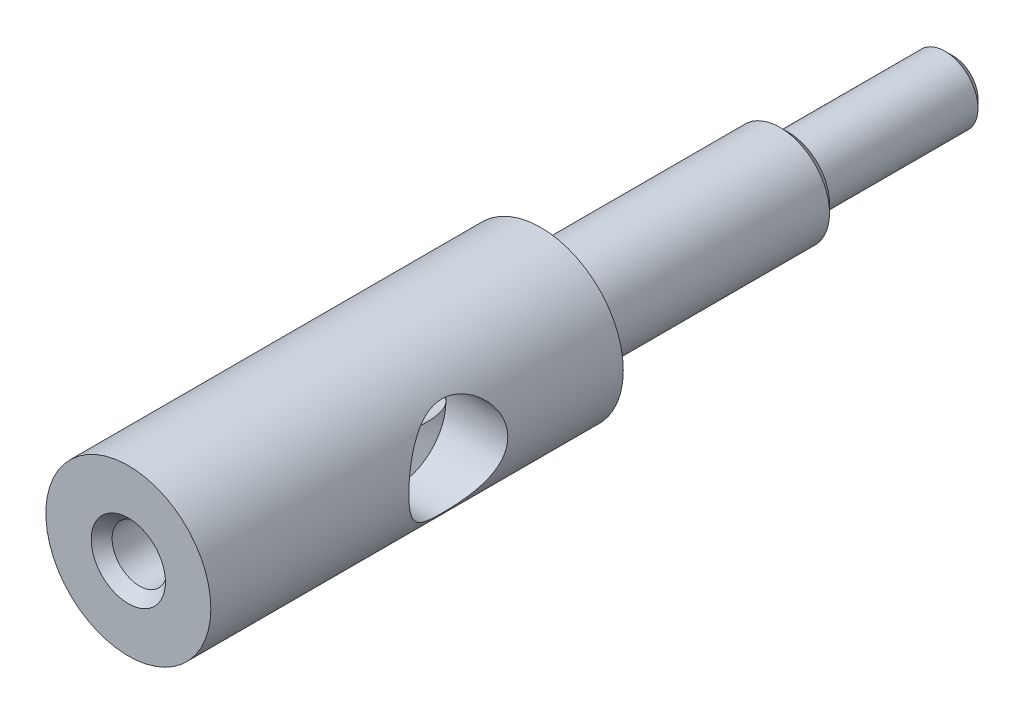
ISO-10303-21;
HEADER;
FILE_DESCRIPTION(('STEP AP214'),'2;1');
FILE_NAME('part.step','',(''),(''),'','','');
FILE_SCHEMA(('AUTOMOTIVE_DESIGN { 1 0 10303 214 1 1 1 1 }'));
ENDSEC;
DATA;
#1=APPLICATION_CONTEXT('core data for automotive mechanical design processes');
#2=APPLICATION_PROTOCOL_DEFINITION('international standard','automotive_design',2000,#1);
#3=PRODUCT_CONTEXT('',#1,'mechanical');
#4=PRODUCT('Part','Part','',(#3));
#5=PRODUCT_RELATED_PRODUCT_CATEGORY('part','',(#4));
#6=PRODUCT_DEFINITION_FORMATION('','',#4);
#7=PRODUCT_DEFINITION_CONTEXT('part definition',#1,'design');
#8=PRODUCT_DEFINITION('design','',#6,#7);
#9=PRODUCT_DEFINITION_SHAPE('','',#8);
#10=(LENGTH_UNIT() NAMED_UNIT(*) SI_UNIT(.MILLI.,.METRE.));
#11=(NAMED_UNIT(*) PLANE_ANGLE_UNIT() SI_UNIT($,.RADIAN.));
#12=(NAMED_UNIT(*) SI_UNIT($,.STERADIAN.) SOLID_ANGLE_UNIT());
#13=UNCERTAINTY_MEASURE_WITH_UNIT(LENGTH_MEASURE(1.E-05),#10,'distance_accuracy_value','');
#14=(GEOMETRIC_REPRESENTATION_CONTEXT(3) GLOBAL_UNCERTAINTY_ASSIGNED_CONTEXT((#13)) GLOBAL_UNIT_ASSIGNED_CONTEXT((#10,
#11,#12)) REPRESENTATION_CONTEXT('',''));
#15=CARTESIAN_POINT('',(0.,0.,0.));
#16=DIRECTION('',(0.,0.,1.));
#17=DIRECTION('',(1.,0.,0.));
#18=AXIS2_PLACEMENT_3D('',#15,#16,#17);
#19=CARTESIAN_POINT('',(0.,0.,-49.000000000035));
#20=DIRECTION('',(0.,0.,1.));
#21=DIRECTION('',(0.,-1.,0.));
#22=AXIS2_PLACEMENT_3D('',#19,#20,#21);
#23=CONICAL_SURFACE('',#22,3.99999999990541,0.785398163369027);
#24=CARTESIAN_POINT('',(0.,0.,-49.));
#25=DIRECTION('',(0.,0.,-1.));
#26=DIRECTION('',(-1.,0.,0.));
#27=AXIS2_PLACEMENT_3D('',#24,#25,#26);
#28=CIRCLE('',#27,4.);
#29=CARTESIAN_POINT('',(-4.,0.,-49.));
#30=VERTEX_POINT('',#29);
#31=EDGE_CURVE('E65',#30,#30,#28,.F.);
#32=ORIENTED_EDGE('',*,*,#31,.F.);
#33=EDGE_LOOP('',(#32));
#34=FACE_BOUND('',#33,.T.);
#35=CARTESIAN_POINT('',(0.,0.,-49.9999999999545));
#36=DIRECTION('',(0.,0.,1.));
#37=DIRECTION('',(0.,-1.,0.));
#38=AXIS2_PLACEMENT_3D('',#35,#36,#37);
#39=CIRCLE('',#38,3.00000000004275);
#40=CARTESIAN_POINT('',(0.,-3.00000000004275,-49.9999999999545));
#41=VERTEX_POINT('',#40);
#42=EDGE_CURVE('E19',#41,#41,#39,.T.);
#43=ORIENTED_EDGE('',*,*,#42,.T.);
#44=EDGE_LOOP('',(#43));
#45=FACE_BOUND('',#44,.T.);
#46=ADVANCED_FACE('F16',(#34,#45),#23,.T.);
#47=CARTESIAN_POINT('',(0.,0.,-30.));
#48=DIRECTION('',(0.,0.,-1.));
#49=DIRECTION('',(-1.,0.,0.));
#50=AXIS2_PLACEMENT_3D('',#47,#48,#49);
#51=CYLINDRICAL_SURFACE('',#50,4.);
#52=ORIENTED_EDGE('',*,*,#31,.T.);
#53=EDGE_LOOP('',(#52));
#54=FACE_BOUND('',#53,.T.);
#55=CARTESIAN_POINT('',(0.,0.,-30.));
#56=DIRECTION('',(0.,0.,-1.));
#57=DIRECTION('',(-1.,0.,0.));
#58=AXIS2_PLACEMENT_3D('',#55,#56,#57);
#59=CIRCLE('',#58,4.);
#60=CARTESIAN_POINT('',(-4.,0.,-30.));
#61=VERTEX_POINT('',#60);
#62=EDGE_CURVE('E54',#61,#61,#59,.T.);
#63=ORIENTED_EDGE('',*,*,#62,.T.);
#64=EDGE_LOOP('',(#63));
#65=FACE_BOUND('',#64,.T.);
#66=ADVANCED_FACE('F48',(#54,#65),#51,.T.);
#67=CARTESIAN_POINT('',(0.,0.,34.9999999999682));
#68=DIRECTION('',(0.,0.,1.));
#69=DIRECTION('',(1.,0.,0.));
#70=AXIS2_PLACEMENT_3D('',#67,#68,#69);
#71=CONICAL_SURFACE('',#70,3.3235000000218,1.02974425868355);
#72=CARTESIAN_POINT('',(0.,0.,33.0030397326482));
#73=VERTEX_POINT('',#72);
#74=VERTEX_LOOP('',#73);
#75=FACE_BOUND('',#74,.T.);
#76=CARTESIAN_POINT('',(0.,0.,35.));
#77=DIRECTION('',(0.,0.,1.));
#78=DIRECTION('',(1.,0.,0.));
#79=AXIS2_PLACEMENT_3D('',#76,#77,#78);
#80=CIRCLE('',#79,3.3235);
#81=CARTESIAN_POINT('',(3.3235,0.,35.));
#82=VERTEX_POINT('',#81);
#83=EDGE_CURVE('E52',#82,#82,#80,.T.);
#84=ORIENTED_EDGE('',*,*,#83,.T.);
#85=EDGE_LOOP('',(#84));
#86=FACE_BOUND('',#85,.T.);
#87=ADVANCED_FACE('F44',(#75,#86),#71,.F.);
#88=CARTESIAN_POINT('',(0.,0.,26.0000000000105));
#89=DIRECTION('',(0.,0.,-1.));
#90=DIRECTION('',(-1.,0.,0.));
#91=AXIS2_PLACEMENT_3D('',#88,#89,#90);
#92=CONICAL_SURFACE('',#91,2.49999999999773,1.0297442586719);
#93=CARTESIAN_POINT('',(0.,0.,27.5021515475942));
#94=VERTEX_POINT('',#93);
#95=VERTEX_LOOP('',#94);
#96=FACE_BOUND('',#95,.T.);
#97=CARTESIAN_POINT('',(0.,0.,26.));
#98=DIRECTION('',(0.,0.,-1.));
#99=DIRECTION('',(-1.,0.,0.));
#100=AXIS2_PLACEMENT_3D('',#97,#98,#99);
#101=CIRCLE('',#100,2.5);
#102=CARTESIAN_POINT('',(2.5,0.,25.9999999999689));
#103=VERTEX_POINT('',#102);
#104=EDGE_CURVE('E37',#103,#103,#101,.T.);
#105=ORIENTED_EDGE('',*,*,#104,.T.);
#106=EDGE_LOOP('',(#105));
#107=FACE_BOUND('',#106,.T.);
#108=ADVANCED_FACE('F47',(#96,#107),#92,.F.);
#109=CARTESIAN_POINT('',(0.,0.,-50.));
#110=DIRECTION('',(0.,0.,1.));
#111=DIRECTION('',(1.,0.,0.));
#112=AXIS2_PLACEMENT_3D('',#109,#110,#111);
#113=PLANE('',#112);
#114=CARTESIAN_POINT('',(0.,0.,-50.));
#115=DIRECTION('',(0.,0.,-1.));
#116=DIRECTION('',(-1.,0.,0.));
#117=AXIS2_PLACEMENT_3D('',#114,#115,#116);
#118=CIRCLE('',#117,2.5);
#119=CARTESIAN_POINT('',(-2.5,0.,-50.));
#120=VERTEX_POINT('',#119);
#121=EDGE_CURVE('E56',#120,#120,#118,.F.);
#122=ORIENTED_EDGE('',*,*,#121,.T.);
#123=EDGE_LOOP('',(#122));
#124=FACE_BOUND('',#123,.T.);
#125=ORIENTED_EDGE('',*,*,#42,.F.);
#126=EDGE_LOOP('',(#125));
#127=FACE_BOUND('',#126,.T.);
#128=ADVANCED_FACE('F165',(#124,#127),#113,.F.);
#129=CARTESIAN_POINT('',(0.,0.,-30.));
#130=DIRECTION('',(0.,0.,1.));
#131=DIRECTION('',(1.,0.,0.));
#132=AXIS2_PLACEMENT_3D('',#129,#130,#131);
#133=PLANE('',#132);
#134=ORIENTED_EDGE('',*,*,#62,.F.);
#135=EDGE_LOOP('',(#134));
#136=FACE_BOUND('',#135,.T.);
#137=CARTESIAN_POINT('',(0.,0.,-29.9999999999727));
#138=DIRECTION('',(0.,0.,1.));
#139=DIRECTION('',(1.,0.,0.));
#140=AXIS2_PLACEMENT_3D('',#137,#138,#139);
#141=CIRCLE('',#140,4.99999999999545);
#142=CARTESIAN_POINT('',(4.99999999999545,0.,-29.9999999999727));
#143=VERTEX_POINT('',#142);
#144=EDGE_CURVE('E156',#143,#143,#141,.T.);
#145=ORIENTED_EDGE('',*,*,#144,.F.);
#146=EDGE_LOOP('',(#145));
#147=FACE_BOUND('',#146,.T.);
#148=ADVANCED_FACE('F168',(#136,#147),#133,.F.);
#149=CARTESIAN_POINT('',(0.,0.,42.5));
#150=DIRECTION('',(0.,0.,1.));
#151=DIRECTION('',(1.,0.,0.));
#152=AXIS2_PLACEMENT_3D('',#149,#150,#151);
#153=CYLINDRICAL_SURFACE('',#152,3.3235);
#154=ORIENTED_EDGE('',*,*,#83,.F.);
#155=EDGE_LOOP('',(#154));
#156=FACE_BOUND('',#155,.T.);
#157=CARTESIAN_POINT('',(0.,0.,48.6465915689109));
#158=DIRECTION('',(0.,0.,1.));
#159=DIRECTION('',(1.,0.,0.));
#160=AXIS2_PLACEMENT_3D('',#157,#158,#159);
#161=CIRCLE('',#160,3.32349999996495);
#162=CARTESIAN_POINT('',(3.32349999996495,0.,48.6465915689109));
#163=VERTEX_POINT('',#162);
#164=EDGE_CURVE('E158',#163,#163,#161,.T.);
#165=ORIENTED_EDGE('',*,*,#164,.T.);
#166=EDGE_LOOP('',(#165));
#167=FACE_BOUND('',#166,.T.);
#168=ADVANCED_FACE('F149',(#156,#167),#153,.F.);
#169=CARTESIAN_POINT('',(0.,0.,-12.));
#170=DIRECTION('',(0.,0.,-1.));
#171=DIRECTION('',(-1.,0.,0.));
#172=AXIS2_PLACEMENT_3D('',#169,#170,#171);
#173=CYLINDRICAL_SURFACE('',#172,2.5);
#174=ORIENTED_EDGE('',*,*,#121,.F.);
#175=EDGE_LOOP('',(#174));
#176=FACE_BOUND('',#175,.T.);
#177=CARTESIAN_POINT('',(2.49999999999481,0.,25.9999999999393));
#178=CARTESIAN_POINT('',(2.50000440681245,-0.0333647014409051,26.0000089604118));
#179=CARTESIAN_POINT('',(2.4993315897283,-0.0667108367074443,25.9986090904969));
#180=CARTESIAN_POINT('',(2.49667492201596,-0.133086425235274,25.9930803026044));
#181=CARTESIAN_POINT('',(2.49469255918183,-0.166116194772112,25.9889544816189));
#182=CARTESIAN_POINT('',(2.48690691588729,-0.263635379538542,25.9727472607381));
#183=CARTESIAN_POINT('',(2.47926276449362,-0.327370538569715,25.9568313606055));
#184=CARTESIAN_POINT('',(2.45740871646023,-0.466044168339284,25.911290808346));
#185=CARTESIAN_POINT('',(2.44206388668205,-0.540003916873495,25.8792939484901));
#186=CARTESIAN_POINT('',(2.40644179879068,-0.681467688186399,25.8049040663342));
#187=CARTESIAN_POINT('',(2.3861407929946,-0.748938381385714,25.7624609823794));
#188=CARTESIAN_POINT('',(2.32894881253672,-0.915266237996505,25.6426658142801));
#189=CARTESIAN_POINT('',(2.28936252993992,-1.00898545918877,25.5595454171396));
#190=CARTESIAN_POINT('',(2.20507738301818,-1.18190703195328,25.3818664703816));
#191=CARTESIAN_POINT('',(2.16036886281796,-1.26108120868553,25.2872862980932));
#192=CARTESIAN_POINT('',(2.06894794646331,-1.40591783384679,25.0929397810345));
#193=CARTESIAN_POINT('',(2.02230036144602,-1.47183690405202,24.9933311589933));
#194=CARTESIAN_POINT('',(1.92726492600323,-1.59425736037914,24.789210529138));
#195=CARTESIAN_POINT('',(1.87887542404483,-1.65074950669691,24.6846938377302));
#196=CARTESIAN_POINT('',(1.78101652617295,-1.75588973577199,24.4718102542157));
#197=CARTESIAN_POINT('',(1.73154407094235,-1.80451107291804,24.363431700513));
#198=CARTESIAN_POINT('',(1.63224068545022,-1.89480671777135,24.1439510032605));
#199=CARTESIAN_POINT('',(1.58240963155579,-1.93647849675054,24.0328478851205));
#200=CARTESIAN_POINT('',(1.48194952665245,-2.01443333240198,23.8063666898566));
#201=CARTESIAN_POINT('',(1.43132319836142,-2.05059962642193,23.6909475028284));
#202=CARTESIAN_POINT('',(1.33068982511614,-2.11728761521465,23.4582040881588));
#203=CARTESIAN_POINT('',(1.28068291247457,-2.14780812275678,23.3408794654604));
#204=CARTESIAN_POINT('',(1.18173949733217,-2.20379800338344,23.1043937169465));
#205=CARTESIAN_POINT('',(1.13280455199716,-2.22926041254413,22.985230299287));
#206=CARTESIAN_POINT('',(1.03667418576344,-2.27555501209775,22.7453358707929));
#207=CARTESIAN_POINT('',(0.989478522006144,-2.29638785098382,22.6246050820207));
#208=CARTESIAN_POINT('',(0.897798370061056,-2.33375102581922,22.3822099147138));
#209=CARTESIAN_POINT('',(0.853300765528386,-2.35030371438694,22.2605539486361));
#210=CARTESIAN_POINT('',(0.767672599828388,-2.37964822557671,22.0155963734945));
#211=CARTESIAN_POINT('',(0.726542354624152,-2.39243969557057,21.8922946112633));
#212=CARTESIAN_POINT('',(0.64891861154054,-2.41464956223955,21.6440850815759));
#213=CARTESIAN_POINT('',(0.612419648701658,-2.42407195878979,21.5191794021648));
#214=CARTESIAN_POINT('',(0.545563242301532,-2.43998762457775,21.2675798928309));
#215=CARTESIAN_POINT('',(0.515204029970234,-2.44648173807472,21.1408865891794));
#216=CARTESIAN_POINT('',(0.456524071725755,-2.45818827647866,20.8567938630557));
#217=CARTESIAN_POINT('',(0.430216815922438,-2.46277876595564,20.6989295023741));
#218=CARTESIAN_POINT('',(0.402323931497229,-2.46743168729128,20.4608108933444));
#219=CARTESIAN_POINT('',(0.394954682091408,-2.4686105104716,20.3812367877592));
#220=CARTESIAN_POINT('',(0.384345653303792,-2.47028521539029,20.2218113070941));
#221=CARTESIAN_POINT('',(0.381105228363137,-2.47078120389367,20.1419599773175));
#222=CARTESIAN_POINT('',(0.378899386542305,-2.47112055428709,19.9822585346068));
#223=CARTESIAN_POINT('',(0.37993061867878,-2.47096442774049,19.9024084698396));
#224=CARTESIAN_POINT('',(0.386207329038559,-2.46999020145378,19.7428855276762));
#225=CARTESIAN_POINT('',(0.391452818180722,-2.46917209999854,19.6632126507396));
#226=CARTESIAN_POINT('',(0.413224618459184,-2.46565961111647,19.4246610652575));
#227=CARTESIAN_POINT('',(0.435786978174012,-2.46190682097384,19.2663225303981));
#228=CARTESIAN_POINT('',(0.485858605160425,-2.45242405258385,18.9955977598412));
#229=CARTESIAN_POINT('',(0.510290324013049,-2.44752413629555,18.8825747972644));
#230=CARTESIAN_POINT('',(0.564592096191312,-2.43557199073528,18.6579519278107));
#231=CARTESIAN_POINT('',(0.594462558550212,-2.42851959955448,18.5463521286422));
#232=CARTESIAN_POINT('',(0.658477271102162,-2.41194957007288,18.3244685431261));
#233=CARTESIAN_POINT('',(0.692625639580007,-2.40242954664362,18.2141861386118));
#234=CARTESIAN_POINT('',(0.764177622305014,-2.38063686095771,17.994972791996));
#235=CARTESIAN_POINT('',(0.801580996506212,-2.36836440157906,17.8860417509117));
#236=CARTESIAN_POINT('',(0.878981755213392,-2.34074473510835,17.6691001959068));
#237=CARTESIAN_POINT('',(0.918987072526821,-2.32538779542411,17.5610937534275));
#238=CARTESIAN_POINT('',(1.00085986189637,-2.29134132270932,17.346318499192));
#239=CARTESIAN_POINT('',(1.04272748523265,-2.27265151856874,17.2395497888716));
#240=CARTESIAN_POINT('',(1.17026524329169,-2.21119649052992,16.9213029638315));
#241=CARTESIAN_POINT('',(1.25796395576036,-2.16301446311637,16.7116287835089));
#242=CARTESIAN_POINT('',(1.41632267974261,-2.06175898025363,16.342938931294));
#243=CARTESIAN_POINT('',(1.48654482417255,-2.01202270239156,16.1828144986984));
#244=CARTESIAN_POINT('',(1.62735887646,-1.89995939641595,15.866470420907));
#245=CARTESIAN_POINT('',(1.69795126571689,-1.83759616177024,15.7102634901181));
#246=CARTESIAN_POINT('',(1.81564288236882,-1.7198817749987,15.4526303041616));
#247=CARTESIAN_POINT('',(1.86309996623077,-1.66856805838708,15.349526739544));
#248=CARTESIAN_POINT('',(1.95682751440309,-1.55759902881056,15.1471194073623));
#249=CARTESIAN_POINT('',(2.00309672869214,-1.49793532310982,15.0478195925341));
#250=CARTESIAN_POINT('',(2.09317396674211,-1.36921772291159,14.8554369092552));
#251=CARTESIAN_POINT('',(2.13699738805614,-1.30023496287849,14.7623142248855));
#252=CARTESIAN_POINT('',(2.22110338700733,-1.1506745879609,14.5842772299084));
#253=CARTESIAN_POINT('',(2.26139504554374,-1.07012820344345,14.4993418084415));
#254=CARTESIAN_POINT('',(2.32334102582648,-0.925186912321404,14.369136064445));
#255=CARTESIAN_POINT('',(2.34664077121755,-0.864758206656846,14.3202674571952));
#256=CARTESIAN_POINT('',(2.38976686599506,-0.737253870397121,14.2299546082895));
#257=CARTESIAN_POINT('',(2.40959081575257,-0.670173697373946,14.1885154953859));
#258=CARTESIAN_POINT('',(2.44463955141455,-0.528345642952532,14.1153323964892));
#259=CARTESIAN_POINT('',(2.45979229301216,-0.453499373684774,14.0837402053272));
#260=CARTESIAN_POINT('',(2.48334956968723,-0.298397672861388,14.034654771837));
#261=CARTESIAN_POINT('',(2.49178337756962,-0.218167375144953,14.0171003689086));
#262=CARTESIAN_POINT('',(2.49749499830045,-0.114221666657666,14.0052130518354));
#263=CARTESIAN_POINT('',(2.49843254982911,-0.0914361726176279,14.0032618912506));
#264=CARTESIAN_POINT('',(2.49968450884905,-0.0457712137515304,14.0006564911939));
#265=CARTESIAN_POINT('',(2.49999883704919,-0.0228917373393486,14.000002416747));
#266=CARTESIAN_POINT('',(2.5,0.,14.0000000000622));
#267=B_SPLINE_CURVE_WITH_KNOTS('',3,(#177,#178,#179,#180,#181,#182,#183,#184,#185,#186,#187,
#188,#189,#190,#191,#192,#193,#194,#195,#196,#197,#198,#199,#200,#201,#202,#203,#204,#205,#206,
#207,#208,#209,#210,#211,#212,#213,#214,#215,#216,#217,#218,#219,#220,#221,#222,#223,#224,#225,
#226,#227,#228,#229,#230,#231,#232,#233,#234,#235,#236,#237,#238,#239,#240,#241,#242,#243,#244,
#245,#246,#247,#248,#249,#250,#251,#252,#253,#254,#255,#256,#257,#258,#259,#260,#261,#262,#263,
#264,#265,#266),.UNSPECIFIED.,.F.,.F.,(4,2,2,2,2,2,2,2,2,2,2,2,2,2,2,2,2,2,2,2,2,2,2,2,2,2,2,2,
2,2,2,2,2,2,2,2,2,2,2,2,2,2,2,2,4),(0.,0.100023840999682,0.199934238441364,0.39734357782308,
0.642094196968456,0.888041392566701,1.27995715543761,1.67262426279943,2.05674321408231,
2.44123647604187,2.8270100277764,3.21292364567541,3.60613270583752,3.99942435864968,
4.39325379355398,4.78702802746034,5.1787022754696,5.57041323269155,5.96165758139093,
6.35278905739761,6.83237007424446,7.07204644652874,7.31168533981601,7.55113627939188,
7.7905878393711,8.26970926304435,8.61677245997098,8.96386176937596,9.31128782256876,
9.65868827591028,10.0072026218071,10.3557453303551,11.0520109792988,11.5970010382104,
12.1435765140528,12.5169977312065,12.890797013503,13.2618891845024,13.6319973540561,
13.8748753351452,14.1179203403268,14.3645452748032,14.6100897550906,14.6787205983664,
14.7473601728117),.UNSPECIFIED.);
#268=CARTESIAN_POINT('',(2.5,0.,14.0000000000311));
#269=VERTEX_POINT('',#268);
#270=EDGE_CURVE('E32',#103,#269,#267,.T.);
#271=ORIENTED_EDGE('',*,*,#270,.T.);
#272=CARTESIAN_POINT('',(2.49999999999842,0.,14.0000000000617));
#273=CARTESIAN_POINT('',(2.50000440681378,0.0333647014405211,13.9999910395885));
#274=CARTESIAN_POINT('',(2.49933158972868,0.0667108367066879,14.0013909095032));
#275=CARTESIAN_POINT('',(2.49667492201567,0.133086425233795,14.0069196973954));
#276=CARTESIAN_POINT('',(2.49469255918182,0.166116194770283,14.011045518381));
#277=CARTESIAN_POINT('',(2.48690691588783,0.263635379535687,14.0272527392618));
#278=CARTESIAN_POINT('',(2.47926276449415,0.327370538566187,14.0431686393943));
#279=CARTESIAN_POINT('',(2.45740871646105,0.466044168334317,14.0887091916534));
#280=CARTESIAN_POINT('',(2.44206388668327,0.540003916867769,14.1207060515091));
#281=CARTESIAN_POINT('',(2.40644179879272,0.681467688179206,14.1950959336646));
#282=CARTESIAN_POINT('',(2.38614079299706,0.748938381377815,14.2375390176191));
#283=CARTESIAN_POINT('',(2.32894881254032,0.915266237987211,14.3573341857178));
#284=CARTESIAN_POINT('',(2.28936252994428,1.00898545917879,14.440454582858));
#285=CARTESIAN_POINT('',(2.20507738302415,1.18190703194207,14.6181335296153));
#286=CARTESIAN_POINT('',(2.16036886282479,1.26108120867376,14.7127137019034));
#287=CARTESIAN_POINT('',(2.06894794647165,1.40591783383448,14.9070602189618));
#288=CARTESIAN_POINT('',(2.022300361455,1.47183690403965,15.0066688410032));
#289=CARTESIAN_POINT('',(1.92726492601351,1.59425736036668,15.2107894708589));
#290=CARTESIAN_POINT('',(1.87887542405579,1.65074950668442,15.3153061622669));
#291=CARTESIAN_POINT('',(1.78101652618527,1.75588973575947,15.5281897457817));
#292=CARTESIAN_POINT('',(1.73154407095537,1.80451107290553,15.6365682994847));
#293=CARTESIAN_POINT('',(1.63224068546465,1.8948067177589,15.8560489967375));
#294=CARTESIAN_POINT('',(1.58240963157094,1.93647849673814,15.9671521148777));
#295=CARTESIAN_POINT('',(1.48194952666871,2.01443333239002,16.1936333101428));
#296=CARTESIAN_POINT('',(1.43132319837806,2.05059962641031,16.3090524971721));
#297=CARTESIAN_POINT('',(1.33068982513359,2.11728761520368,16.5417959118438));
#298=CARTESIAN_POINT('',(1.28068291249242,2.14780812274613,16.6591205345432));
#299=CARTESIAN_POINT('',(1.18173949735089,2.20379800337339,16.8956062830593));
#300=CARTESIAN_POINT('',(1.13280455201632,2.22926041253438,17.0147697007198));
#301=CARTESIAN_POINT('',(1.03667418578355,2.27555501208858,17.254664129216));
#302=CARTESIAN_POINT('',(0.989478522026754,2.29638785097493,17.3753949179893));
#303=CARTESIAN_POINT('',(0.89779837008274,2.33375102581087,17.6177900852983));
#304=CARTESIAN_POINT('',(0.853300765550645,2.35030371437885,17.739446051377));
#305=CARTESIAN_POINT('',(0.767672599851869,2.37964822556913,17.9844036265207));
#306=CARTESIAN_POINT('',(0.726542354648281,2.39243969556323,18.1077053887529));
#307=CARTESIAN_POINT('',(0.648918611566054,2.41464956223268,18.3559149184424));
#308=CARTESIAN_POINT('',(0.61241964872791,2.42407195878315,18.4808205978545));
#309=CARTESIAN_POINT('',(0.545563242329362,2.43998762457152,18.7324201071904));
#310=CARTESIAN_POINT('',(0.515204029998904,2.44648173806868,18.8591134108429));
#311=CARTESIAN_POINT('',(0.456524071755983,2.45818827647303,19.1432061369708));
#312=CARTESIAN_POINT('',(0.430216815953563,2.4627787659502,19.3010704976556));
#313=CARTESIAN_POINT('',(0.402323931530046,2.46743168728593,19.53918910669));
#314=CARTESIAN_POINT('',(0.394954682124847,2.46861051046625,19.6187632122768));
#315=CARTESIAN_POINT('',(0.384345653338572,2.47028521538488,19.7781886929451));
#316=CARTESIAN_POINT('',(0.381105228398636,2.4707812038882,19.8580400227232));
#317=CARTESIAN_POINT('',(0.37889938657931,2.47112055428142,20.017741465437));
#318=CARTESIAN_POINT('',(0.379930618716576,2.47096442773468,20.0975915302057));
#319=CARTESIAN_POINT('',(0.386207329077979,2.46999020144762,20.2571144723722));
#320=CARTESIAN_POINT('',(0.391452818220973,2.46917209999216,20.3367873493103));
#321=CARTESIAN_POINT('',(0.413224618501941,2.46565961110932,20.5753389347969));
#322=CARTESIAN_POINT('',(0.43578697821845,2.46190682096599,20.7336774696592));
#323=CARTESIAN_POINT('',(0.4858586052079,2.45242405257446,21.0044022402226));
#324=CARTESIAN_POINT('',(0.510290324062013,2.44752413628536,21.117425202803));
#325=CARTESIAN_POINT('',(0.564592096243277,2.43557199072325,21.3420480722638));
#326=CARTESIAN_POINT('',(0.594462558603688,2.42851959954141,21.4536478714358));
#327=CARTESIAN_POINT('',(0.658477271158635,2.41194957005749,21.6755314569589));
#328=CARTESIAN_POINT('',(0.692625639637965,2.40242954662694,21.7858138614767));
#329=CARTESIAN_POINT('',(0.764177622365896,2.38063686093819,22.0050272080994));
#330=CARTESIAN_POINT('',(0.801580996568533,2.368364401558,22.1139582491871));
#331=CARTESIAN_POINT('',(0.878981755278501,2.34074473508393,22.3308998041988));
#332=CARTESIAN_POINT('',(0.918987072593278,2.32538779539788,22.4389062466814));
#333=CARTESIAN_POINT('',(1.00085986196545,2.29134132267918,22.6536815009234));
#334=CARTESIAN_POINT('',(1.04272748530301,2.2726515185365,22.760450211247));
#335=CARTESIAN_POINT('',(1.17026524336576,2.2111964904909,23.0786970362967));
#336=CARTESIAN_POINT('',(1.25796395583675,2.16301446307219,23.2883712166255));
#337=CARTESIAN_POINT('',(1.41632267981775,2.06175898020193,23.6570610688392));
#338=CARTESIAN_POINT('',(1.48654482424412,2.01202270233858,23.8171855014278));
#339=CARTESIAN_POINT('',(1.62735887652412,1.89995939636092,24.1335295792052));
#340=CARTESIAN_POINT('',(1.69795126577714,1.83759616171444,24.2897365099871));
#341=CARTESIAN_POINT('',(1.81564288242167,1.71988177494279,24.5473696959304));
#342=CARTESIAN_POINT('',(1.86309996628017,1.6685680583318,24.6504732605418));
#343=CARTESIAN_POINT('',(1.95682751444555,1.55759902875709,24.852880592711));
#344=CARTESIAN_POINT('',(2.00309672873111,1.49793532305754,24.952180407533));
#345=CARTESIAN_POINT('',(2.09317396677419,1.36921772286236,25.1445630907997));
#346=CARTESIAN_POINT('',(2.13699738808481,1.30023496283113,25.2376857751635));
#347=CARTESIAN_POINT('',(2.22110338702934,1.15067458791814,25.4157227701291));
#348=CARTESIAN_POINT('',(2.2613950455625,1.07012820340343,25.5006581915903));
#349=CARTESIAN_POINT('',(2.32334102584088,0.925186912285178,25.6308639355796));
#350=CARTESIAN_POINT('',(2.34664077123067,0.864758206621158,25.6797325428274));
#351=CARTESIAN_POINT('',(2.38976686600565,0.737253870362725,25.7700453917291));
#352=CARTESIAN_POINT('',(2.40959081576189,0.670173697340305,25.8114845046307));
#353=CARTESIAN_POINT('',(2.44463955142139,0.528345642920717,25.8846676035234));
#354=CARTESIAN_POINT('',(2.45979229301778,0.453499373654034,25.9162597946832));
#355=CARTESIAN_POINT('',(2.48334956969057,0.298397672833234,25.9653452281695));
#356=CARTESIAN_POINT('',(2.4917833775719,0.218167375118305,25.9828996310959));
#357=CARTESIAN_POINT('',(2.49749499830137,0.114221666636863,25.9947869481664));
#358=CARTESIAN_POINT('',(2.49843254982968,0.0914361726009671,25.9967381087505));
#359=CARTESIAN_POINT('',(2.49968450884916,0.045771213743211,25.9993435088063));
#360=CARTESIAN_POINT('',(2.49999883704919,0.0228917373352288,25.999997583253));
#361=CARTESIAN_POINT('',(2.5,1.21083793963502E-13,25.9999999999378));
#362=B_SPLINE_CURVE_WITH_KNOTS('',3,(#272,#273,#274,#275,#276,#277,#278,#279,#280,#281,#282,
#283,#284,#285,#286,#287,#288,#289,#290,#291,#292,#293,#294,#295,#296,#297,#298,#299,#300,#301,
#302,#303,#304,#305,#306,#307,#308,#309,#310,#311,#312,#313,#314,#315,#316,#317,#318,#319,#320,
#321,#322,#323,#324,#325,#326,#327,#328,#329,#330,#331,#332,#333,#334,#335,#336,#337,#338,#339,
#340,#341,#342,#343,#344,#345,#346,#347,#348,#349,#350,#351,#352,#353,#354,#355,#356,#357,#358,
#359,#360,#361),.UNSPECIFIED.,.F.,.F.,(4,2,2,2,2,2,2,2,2,2,2,2,2,2,2,2,2,2,2,2,2,2,2,2,2,2,2,2,
2,2,2,2,2,2,2,2,2,2,2,2,2,2,2,2,4),(0.,0.100023840998589,0.199934238439208,0.397343577818865,
0.642094196961783,0.888041392557537,1.27995715542575,1.67262426278488,2.05674321406743,
2.44123647602666,2.82701002776088,3.21292364565959,3.60613270582425,3.99942435863898,
4.39325379354586,4.78702802745479,5.17870227546643,5.57041323269075,5.96165758139249,
6.35278905740153,6.8323700742574,7.0720464465462,7.31168533983799,7.55113627941856,
7.79058783940248,8.26970926308516,8.61677246002335,8.96386176943987,9.31128782264423,
9.6586882759973,10.0072026219054,10.3557453304647,11.0520109794309,11.597001038321,
12.1435765141418,12.5169977312752,12.8907970135514,13.2618891845307,13.6319973540644,
13.8748753351476,14.1179203403234,14.3645452747938,14.6100897550753,14.6787205983385,
14.7473601727712),.UNSPECIFIED.);
#363=EDGE_CURVE('E113',#269,#103,#362,.T.);
#364=ORIENTED_EDGE('',*,*,#363,.T.);
#365=ORIENTED_EDGE('',*,*,#104,.F.);
#366=EDGE_LOOP('',(#271,#364,#365));
#367=FACE_BOUND('',#366,.T.);
#368=ADVANCED_FACE('F125',(#176,#367),#173,.F.);
#369=CARTESIAN_POINT('',(0.,0.,-29.0000000000532));
#370=DIRECTION('',(0.,0.,1.));
#371=DIRECTION('',(1.,0.,0.));
#372=AXIS2_PLACEMENT_3D('',#369,#370,#371);
#373=CONICAL_SURFACE('',#372,5.99999999991496,0.785398163397448);
#374=CARTESIAN_POINT('',(0.,0.,-29.));
#375=DIRECTION('',(0.,0.,-1.));
#376=DIRECTION('',(-1.,0.,0.));
#377=AXIS2_PLACEMENT_3D('',#374,#375,#376);
#378=CIRCLE('',#377,6.);
#379=CARTESIAN_POINT('',(-6.,0.,-29.));
#380=VERTEX_POINT('',#379);
#381=EDGE_CURVE('E112',#380,#380,#378,.F.);
#382=ORIENTED_EDGE('',*,*,#381,.F.);
#383=EDGE_LOOP('',(#382));
#384=FACE_BOUND('',#383,.T.);
#385=ORIENTED_EDGE('',*,*,#144,.T.);
#386=EDGE_LOOP('',(#385));
#387=FACE_BOUND('',#386,.T.);
#388=ADVANCED_FACE('F142',(#384,#387),#373,.T.);
#389=CARTESIAN_POINT('',(0.,0.,50.0000000000114));
#390=DIRECTION('',(0.,0.,1.));
#391=DIRECTION('',(1.,0.,0.));
#392=AXIS2_PLACEMENT_3D('',#389,#390,#391);
#393=CONICAL_SURFACE('',#392,4.50000000000728,0.715584993333689);
#394=ORIENTED_EDGE('',*,*,#164,.F.);
#395=EDGE_LOOP('',(#394));
#396=FACE_BOUND('',#395,.T.);
#397=CARTESIAN_POINT('',(0.,0.,50.0000000000114));
#398=DIRECTION('',(0.,0.,1.));
#399=DIRECTION('',(1.,0.,0.));
#400=AXIS2_PLACEMENT_3D('',#397,#398,#399);
#401=CIRCLE('',#400,4.50000000000728);
#402=CARTESIAN_POINT('',(4.50000000000728,0.,50.0000000000114));
#403=VERTEX_POINT('',#402);
#404=EDGE_CURVE('E109',#403,#403,#401,.T.);
#405=ORIENTED_EDGE('',*,*,#404,.T.);
#406=EDGE_LOOP('',(#405));
#407=FACE_BOUND('',#406,.T.);
#408=ADVANCED_FACE('F139',(#396,#407),#393,.F.);
#409=CARTESIAN_POINT('',(2.50000000005457,0.,20.));
#410=DIRECTION('',(1.,0.,0.));
#411=DIRECTION('',(0.,0.,-1.));
#412=AXIS2_PLACEMENT_3D('',#409,#410,#411);
#413=CONICAL_SURFACE('',#412,6.00000000002865,1.02974425868274);
#414=CARTESIAN_POINT('',(2.5,0.,20.));
#415=DIRECTION('',(1.,0.,0.));
#416=DIRECTION('',(0.,0.,-1.));
#417=AXIS2_PLACEMENT_3D('',#414,#415,#416);
#418=CIRCLE('',#417,6.);
#419=EDGE_CURVE('E107',#103,#269,#418,.T.);
#420=ORIENTED_EDGE('',*,*,#419,.T.);
#421=ORIENTED_EDGE('',*,*,#270,.F.);
#422=EDGE_LOOP('',(#420,#421));
#423=FACE_BOUND('',#422,.T.);
#424=ADVANCED_FACE('F134',(#423),#413,.F.);
#425=CARTESIAN_POINT('',(2.50000000005457,0.,20.));
#426=DIRECTION('',(1.,0.,0.));
#427=DIRECTION('',(0.,0.,-1.));
#428=AXIS2_PLACEMENT_3D('',#425,#426,#427);
#429=CONICAL_SURFACE('',#428,6.00000000002865,1.02974425869112);
#430=CARTESIAN_POINT('',(2.5,0.,20.));
#431=DIRECTION('',(1.,0.,0.));
#432=DIRECTION('',(0.,0.,-1.));
#433=AXIS2_PLACEMENT_3D('',#430,#431,#432);
#434=CIRCLE('',#433,6.);
#435=EDGE_CURVE('E61',#269,#103,#434,.T.);
#436=ORIENTED_EDGE('',*,*,#435,.T.);
#437=ORIENTED_EDGE('',*,*,#363,.F.);
#438=EDGE_LOOP('',(#436,#437));
#439=FACE_BOUND('',#438,.T.);
#440=ADVANCED_FACE('F129',(#439),#429,.F.);
#441=CARTESIAN_POINT('',(0.,0.,0.));
#442=DIRECTION('',(0.,0.,-1.));
#443=DIRECTION('',(-1.,0.,0.));
#444=AXIS2_PLACEMENT_3D('',#441,#442,#443);
#445=CYLINDRICAL_SURFACE('',#444,6.);
#446=ORIENTED_EDGE('',*,*,#381,.T.);
#447=EDGE_LOOP('',(#446));
#448=FACE_BOUND('',#447,.T.);
#449=CARTESIAN_POINT('',(0.,0.,0.));
#450=DIRECTION('',(0.,0.,-1.));
#451=DIRECTION('',(-1.,0.,0.));
#452=AXIS2_PLACEMENT_3D('',#449,#450,#451);
#453=CIRCLE('',#452,6.);
#454=CARTESIAN_POINT('',(-6.,0.,0.));
#455=VERTEX_POINT('',#454);
#456=EDGE_CURVE('E98',#455,#455,#453,.F.);
#457=ORIENTED_EDGE('',*,*,#456,.F.);
#458=EDGE_LOOP('',(#457));
#459=FACE_BOUND('',#458,.T.);
#460=ADVANCED_FACE('F133',(#448,#459),#445,.T.);
#461=CARTESIAN_POINT('',(0.,0.,50.));
#462=DIRECTION('',(0.,0.,-1.));
#463=DIRECTION('',(-1.,0.,0.));
#464=AXIS2_PLACEMENT_3D('',#461,#462,#463);
#465=PLANE('',#464);
#466=ORIENTED_EDGE('',*,*,#404,.F.);
#467=EDGE_LOOP('',(#466));
#468=FACE_BOUND('',#467,.T.);
#469=CARTESIAN_POINT('',(0.,0.,50.));
#470=DIRECTION('',(0.,0.,1.));
#471=DIRECTION('',(1.,0.,0.));
#472=AXIS2_PLACEMENT_3D('',#469,#470,#471);
#473=CIRCLE('',#472,10.);
#474=CARTESIAN_POINT('',(10.,0.,50.));
#475=VERTEX_POINT('',#474);
#476=EDGE_CURVE('E76',#475,#475,#473,.F.);
#477=ORIENTED_EDGE('',*,*,#476,.F.);
#478=EDGE_LOOP('',(#477));
#479=FACE_BOUND('',#478,.T.);
#480=ADVANCED_FACE('F93',(#468,#479),#465,.F.);
#481=CARTESIAN_POINT('',(6.25,0.,20.));
#482=DIRECTION('',(1.,0.,0.));
#483=DIRECTION('',(0.,0.,-1.));
#484=AXIS2_PLACEMENT_3D('',#481,#482,#483);
#485=CYLINDRICAL_SURFACE('',#484,6.);
#486=ORIENTED_EDGE('',*,*,#419,.F.);
#487=ORIENTED_EDGE('',*,*,#435,.F.);
#488=EDGE_LOOP('',(#486,#487));
#489=FACE_BOUND('',#488,.T.);
#490=CARTESIAN_POINT('',(10.,0.,14.));
#491=CARTESIAN_POINT('',(9.99999872825889,-0.153531686138264,14.0000013816903));
#492=CARTESIAN_POINT('',(9.99645510789288,-0.307105648462346,14.0059023860349));
#493=CARTESIAN_POINT('',(9.98236442021754,-0.61309557357246,14.0294317292242));
#494=CARTESIAN_POINT('',(9.9718131394423,-0.765510783841153,14.0470671235673));
#495=CARTESIAN_POINT('',(9.94394385208164,-1.06823499581478,14.0938698229989));
#496=CARTESIAN_POINT('',(9.92661287415165,-1.21853938448112,14.1230592352411));
#497=CARTESIAN_POINT('',(9.88560184438918,-1.51571516795823,14.192598590197));
#498=CARTESIAN_POINT('',(9.86191907649991,-1.66258506488647,14.232953307484));
#499=CARTESIAN_POINT('',(9.80890458439574,-1.95109688278542,14.3240880051035));
#500=CARTESIAN_POINT('',(9.77960431118666,-2.09276290971841,14.3748100412986));
#501=CARTESIAN_POINT('',(9.71591810779116,-2.37093574059979,14.4862764398217));
#502=CARTESIAN_POINT('',(9.68153021299886,-2.50744052583243,14.5470246748593));
#503=CARTESIAN_POINT('',(9.57184016398378,-2.90796746903218,14.7433867492464));
#504=CARTESIAN_POINT('',(9.48994089898179,-3.16337192847723,14.8932363424785));
#505=CARTESIAN_POINT('',(9.308211017848,-3.66523682496777,15.2391075398413));
#506=CARTESIAN_POINT('',(9.20748807553353,-3.90951948405156,15.437783798142));
#507=CARTESIAN_POINT('',(9.00120254438304,-4.36354438536642,15.8698969375821));
#508=CARTESIAN_POINT('',(8.89563384383488,-4.57324138603012,16.1033785999088));
#509=CARTESIAN_POINT('',(8.73441160726738,-4.87082590292458,16.4919991480812));
#510=CARTESIAN_POINT('',(8.67715712187566,-4.9718235251733,16.6366329285826));
#511=CARTESIAN_POINT('',(8.56585294266988,-5.1612216197681,16.9351950073579));
#512=CARTESIAN_POINT('',(8.51180377901337,-5.24962001158628,17.0891248347396));
#513=CARTESIAN_POINT('',(8.40890817248991,-5.41290816146996,17.4053785486951));
#514=CARTESIAN_POINT('',(8.36005495955987,-5.48781558810969,17.5676910927351));
#515=CARTESIAN_POINT('',(8.26947580367657,-5.62338176372034,17.9000585357109));
#516=CARTESIAN_POINT('',(8.22774720253814,-5.68404583005722,18.0701105169459));
#517=CARTESIAN_POINT('',(8.16237612468307,-5.77737220588803,18.3749200365592));
#518=CARTESIAN_POINT('',(8.13679955951719,-5.81325887187104,18.5082832625196));
#519=CARTESIAN_POINT('',(8.09168023848003,-5.87590035592506,18.7781293421835));
#520=CARTESIAN_POINT('',(8.07213614596353,-5.90265719707592,18.9146114976015));
#521=CARTESIAN_POINT('',(8.03976792064864,-5.94666967590928,19.1897480619239));
#522=CARTESIAN_POINT('',(8.02693688726176,-5.96393507111171,19.3284000886999));
#523=CARTESIAN_POINT('',(8.00843825757383,-5.98875265891436,19.6070549247257));
#524=CARTESIAN_POINT('',(8.00277078457519,-5.99630468432374,19.7470577571843));
#525=CARTESIAN_POINT('',(7.99881555313761,-6.00157990754134,20.0276304765804));
#526=CARTESIAN_POINT('',(8.00054234218248,-5.99928372996389,20.1682009372516));
#527=CARTESIAN_POINT('',(8.0113400716658,-5.98485668860681,20.4485473323247));
#528=CARTESIAN_POINT('',(8.02041104781167,-5.97272577701072,20.5883232628604));
#529=CARTESIAN_POINT('',(8.0455596471478,-5.93880584691841,20.8661231511361));
#530=CARTESIAN_POINT('',(8.06164043045402,-5.91701247237724,21.0041462897791));
#531=CARTESIAN_POINT('',(8.10022471603912,-5.86407894513563,21.27749457523));
#532=CARTESIAN_POINT('',(8.12273084291465,-5.83293497267421,21.4128185952974));
#533=CARTESIAN_POINT('',(8.19812137254389,-5.72698049516144,21.8099613167139));
#534=CARTESIAN_POINT('',(8.25926913013214,-5.6391515840514,22.0668716810671));
#535=CARTESIAN_POINT('',(8.39708194814811,-5.43179998802236,22.5628185311388));
#536=CARTESIAN_POINT('',(8.47375263178122,-5.31226581294005,22.8018484965587));
#537=CARTESIAN_POINT('',(8.65022096219975,-5.02070305749749,23.299944116065));
#538=CARTESIAN_POINT('',(8.75171846935796,-4.84315066078773,23.5552074541789));
#539=CARTESIAN_POINT('',(8.90582049233895,-4.54957836214343,23.9147610114726));
#540=CARTESIAN_POINT('',(8.95753863983827,-4.44708872609228,24.0308042223506));
#541=CARTESIAN_POINT('',(9.06053294663235,-4.23329699684439,24.2547798666501));
#542=CARTESIAN_POINT('',(9.11180902810446,-4.12199338577043,24.362710896787));
#543=CARTESIAN_POINT('',(9.21989755037799,-3.87480880892233,24.5844465930044));
#544=CARTESIAN_POINT('',(9.27648123309979,-3.73766769712738,24.6969613300344));
#545=CARTESIAN_POINT('',(9.38612684425356,-3.45309441530468,24.9099601462505));
#546=CARTESIAN_POINT('',(9.43919005268525,-3.305666026047,25.0104486088388));
#547=CARTESIAN_POINT('',(9.54035650964078,-3.00122007563012,25.1985272316595));
#548=CARTESIAN_POINT('',(9.58846081550866,-2.84420457006534,25.2861201432115));
#549=CARTESIAN_POINT('',(9.67833058258192,-2.52149661769514,25.4474370852207));
#550=CARTESIAN_POINT('',(9.72009796610954,-2.35580682285561,25.5211653231952));
#551=CARTESIAN_POINT('',(9.78867449014599,-2.04974881464993,25.6409275123867));
#552=CARTESIAN_POINT('',(9.81681402941611,-1.91068968876909,25.6895596474247));
#553=CARTESIAN_POINT('',(9.86755726734515,-1.62845239037675,25.776672224801));
#554=CARTESIAN_POINT('',(9.89016200958964,-1.48527500006162,25.8151545809852));
#555=CARTESIAN_POINT('',(9.9292884727077,-1.19602742328206,25.8814525093705));
#556=CARTESIAN_POINT('',(9.94582480787909,-1.04996509135932,25.9092937150309));
#557=CARTESIAN_POINT('',(9.97250153782879,-0.755658238012754,25.9540837303338));
#558=CARTESIAN_POINT('',(9.98264540800494,-0.60741494725546,25.9710384587333));
#559=CARTESIAN_POINT('',(9.99297807674892,-0.382393043013935,25.9882909849005));
#560=CARTESIAN_POINT('',(9.99560922482052,-0.306013493040643,25.9926796513495));
#561=CARTESIAN_POINT('',(9.99912061584413,-0.153092811745452,25.9985346908721));
#562=CARTESIAN_POINT('',(10.0000006340964,-0.0765516609487053,26.0000006889176));
#563=CARTESIAN_POINT('',(9.99999872825889,0.153531686138263,25.9999986183097));
#564=CARTESIAN_POINT('',(9.99645510789288,0.307105648462344,25.9940976139651));
#565=CARTESIAN_POINT('',(9.98236442021754,0.613095573572458,25.9705682707758));
#566=CARTESIAN_POINT('',(9.9718131394423,0.765510783841152,25.9529328764327));
#567=CARTESIAN_POINT('',(9.94394385208164,1.06823499581478,25.9061301770011));
#568=CARTESIAN_POINT('',(9.92661287415165,1.21853938448112,25.8769407647589));
#569=CARTESIAN_POINT('',(9.88560184438918,1.51571516795823,25.807401409803));
#570=CARTESIAN_POINT('',(9.86191907649991,1.66258506488646,25.767046692516));
#571=CARTESIAN_POINT('',(9.80890458439574,1.95109688278541,25.6759119948965));
#572=CARTESIAN_POINT('',(9.77960431118666,2.09276290971841,25.6251899587014));
#573=CARTESIAN_POINT('',(9.71591810779116,2.37093574059979,25.5137235601783));
#574=CARTESIAN_POINT('',(9.68153021299886,2.50744052583243,25.4529753251407));
#575=CARTESIAN_POINT('',(9.57184016398377,2.90796746903218,25.2566132507535));
#576=CARTESIAN_POINT('',(9.48994089898179,3.16337192847722,25.1067636575215));
#577=CARTESIAN_POINT('',(9.308211017848,3.66523682496776,24.7608924601587));
#578=CARTESIAN_POINT('',(9.20748807553353,3.90951948405156,24.562216201858));
#579=CARTESIAN_POINT('',(9.00120254438304,4.36354438536642,24.1301030624179));
#580=CARTESIAN_POINT('',(8.89563384383488,4.57324138603012,23.8966214000912));
#581=CARTESIAN_POINT('',(8.73441160726738,4.87082590292458,23.5080008519188));
#582=CARTESIAN_POINT('',(8.67715712187566,4.9718235251733,23.3633670714174));
#583=CARTESIAN_POINT('',(8.56585294266987,5.1612216197681,23.0648049926421));
#584=CARTESIAN_POINT('',(8.51180377901337,5.24962001158628,22.9108751652604));
#585=CARTESIAN_POINT('',(8.40890817248992,5.41290816146996,22.5946214513049));
#586=CARTESIAN_POINT('',(8.36005495955987,5.48781558810968,22.4323089072649));
#587=CARTESIAN_POINT('',(8.26947580367657,5.62338176372034,22.0999414642891));
#588=CARTESIAN_POINT('',(8.22774720253814,5.68404583005722,21.9298894830541));
#589=CARTESIAN_POINT('',(8.16237612468307,5.77737220588803,21.6250799634408));
#590=CARTESIAN_POINT('',(8.13679955951719,5.81325887187104,21.4917167374804));
#591=CARTESIAN_POINT('',(8.09168023848003,5.87590035592506,21.2218706578165));
#592=CARTESIAN_POINT('',(8.07213614596354,5.90265719707592,21.0853885023985));
#593=CARTESIAN_POINT('',(8.03976792064864,5.94666967590928,20.8102519380761));
#594=CARTESIAN_POINT('',(8.02693688726176,5.96393507111171,20.6715999113001));
#595=CARTESIAN_POINT('',(8.00843825757383,5.98875265891436,20.3929450752743));
#596=CARTESIAN_POINT('',(8.00277078457519,5.99630468432374,20.2529422428157));
#597=CARTESIAN_POINT('',(7.99881555313761,6.00157990754134,19.9723695234196));
#598=CARTESIAN_POINT('',(8.00054234218248,5.99928372996389,19.8317990627484));
#599=CARTESIAN_POINT('',(8.0113400716658,5.98485668860681,19.5514526676753));
#600=CARTESIAN_POINT('',(8.02041104781167,5.97272577701072,19.4116767371396));
#601=CARTESIAN_POINT('',(8.0455596471478,5.93880584691841,19.1338768488639));
#602=CARTESIAN_POINT('',(8.06164043045402,5.91701247237724,18.9958537102209));
#603=CARTESIAN_POINT('',(8.10022471603911,5.86407894513563,18.72250542477));
#604=CARTESIAN_POINT('',(8.12273084291465,5.83293497267422,18.5871814047026));
#605=CARTESIAN_POINT('',(8.19812137254389,5.72698049516144,18.1900386832861));
#606=CARTESIAN_POINT('',(8.25926913013213,5.63915158405141,17.9331283189329));
#607=CARTESIAN_POINT('',(8.39708194814811,5.43179998802236,17.4371814688612));
#608=CARTESIAN_POINT('',(8.47375263178122,5.31226581294005,17.1981515034413));
#609=CARTESIAN_POINT('',(8.65022096219974,5.0207030574975,16.700055883935));
#610=CARTESIAN_POINT('',(8.75171846935796,4.84315066078774,16.4447925458211));
#611=CARTESIAN_POINT('',(8.90582049233894,4.54957836214344,16.0852389885274));
#612=CARTESIAN_POINT('',(8.95753863983827,4.44708872609228,15.9691957776494));
#613=CARTESIAN_POINT('',(9.06053294663235,4.23329699684439,15.7452201333499));
#614=CARTESIAN_POINT('',(9.11180902810446,4.12199338577043,15.637289103213));
#615=CARTESIAN_POINT('',(9.21989755037799,3.87480880892234,15.4155534069956));
#616=CARTESIAN_POINT('',(9.27648123309979,3.73766769712739,15.3030386699656));
#617=CARTESIAN_POINT('',(9.38612684425355,3.45309441530468,15.0900398537495));
#618=CARTESIAN_POINT('',(9.43919005268524,3.305666026047,14.9895513911612));
#619=CARTESIAN_POINT('',(9.54035650964078,3.00122007563012,14.8014727683405));
#620=CARTESIAN_POINT('',(9.58846081550866,2.84420457006535,14.7138798567885));
#621=CARTESIAN_POINT('',(9.67833058258192,2.52149661769515,14.5525629147793));
#622=CARTESIAN_POINT('',(9.72009796610954,2.35580682285562,14.4788346768048));
#623=CARTESIAN_POINT('',(9.78867449014599,2.04974881464993,14.3590724876133));
#624=CARTESIAN_POINT('',(9.81681402941611,1.9106896887691,14.3104403525753));
#625=CARTESIAN_POINT('',(9.86755726734515,1.62845239037676,14.223327775199));
#626=CARTESIAN_POINT('',(9.89016200958964,1.48527500006163,14.1848454190148));
#627=CARTESIAN_POINT('',(9.9292884727077,1.19602742328206,14.1185474906295));
#628=CARTESIAN_POINT('',(9.94582480787909,1.04996509135932,14.0907062849691));
#629=CARTESIAN_POINT('',(9.97250153782879,0.755658238012758,14.0459162696662));
#630=CARTESIAN_POINT('',(9.98264540800494,0.607414947255465,14.0289615412667));
#631=CARTESIAN_POINT('',(9.99297807674892,0.38239304301394,14.0117090150995));
#632=CARTESIAN_POINT('',(9.99560922482052,0.306013493040646,14.0073203486505));
#633=CARTESIAN_POINT('',(9.99912061584413,0.153092811745453,14.0014653091279));
#634=CARTESIAN_POINT('',(10.0000006340964,0.0765516609487049,13.9999993110824));
#635=CARTESIAN_POINT('',(10.,0.,14.));
#636=B_SPLINE_CURVE_WITH_KNOTS('',3,(#490,#491,#492,#493,#494,#495,#496,#497,#498,#499,#500,
#501,#502,#503,#504,#505,#506,#507,#508,#509,#510,#511,#512,#513,#514,#515,#516,#517,#518,#519,
#520,#521,#522,#523,#524,#525,#526,#527,#528,#529,#530,#531,#532,#533,#534,#535,#536,#537,#538,
#539,#540,#541,#542,#543,#544,#545,#546,#547,#548,#549,#550,#551,#552,#553,#554,#555,#556,#557,
#558,#559,#560,#561,#562,#563,#564,#565,#566,#567,#568,#569,#570,#571,#572,#573,#574,#575,#576,
#577,#578,#579,#580,#581,#582,#583,#584,#585,#586,#587,#588,#589,#590,#591,#592,#593,#594,#595,
#596,#597,#598,#599,#600,#601,#602,#603,#604,#605,#606,#607,#608,#609,#610,#611,#612,#613,#614,
#615,#616,#617,#618,#619,#620,#621,#622,#623,#624,#625,#626,#627,#628,#629,#630,#631,#632,#633,
#634,#635),.UNSPECIFIED.,.T.,.F.,(4,2,2,2,2,2,2,2,2,2,2,2,2,2,2,2,2,2,2,2,2,2,2,2,2,2,2,2,2,2,2,
2,2,2,2,2,2,2,2,2,2,2,2,2,2,2,2,2,2,2,2,2,2,2,2,2,2,2,2,2,2,2,2,2,2,2,2,2,2,2,2,2,4),(0.,
0.460515289559126,0.92130772214879,1.38298611805802,1.84486224555032,2.30422421668554,
2.76376403756277,3.68167313337876,4.66978066306469,5.65917065906821,6.21499477025326,
6.77091055934653,7.32609290797971,7.88106766385907,8.3020147578703,8.72286851345639,
9.14328880452465,9.56371633195664,9.98497138886122,10.4062284939194,10.8276757041006,
11.2492953121367,12.0807575730161,12.9125215731151,13.8896908054027,14.3790477313491,
14.8684891147457,15.4263877222318,15.9840823604603,16.5416578392391,17.0990638363643,
17.5485397704537,17.9979308905139,18.4462325454839,18.8942902610959,19.1238760129409,
19.3534912226396,19.8140065121987,20.2747989447884,20.7364773406976,21.1983534681899,
21.6577154393251,22.1172552602024,23.0351643560183,24.0232718857043,25.0126618817078,
25.5684859928928,26.1244017819861,26.6795841306193,27.2345588864987,27.6555059805099,
28.076359736096,28.4967800271642,28.9172075545962,29.3384626115008,29.759719716559,
30.1811669267401,30.6027865347763,31.4342487956557,32.2660127957547,33.2431820280423,
33.7325389539887,34.2219803373853,34.7798789448714,35.3375735830998,35.8951490618787,
36.4525550590039,36.9020309930933,37.3514221131535,37.7997237681235,38.2477814837355,
38.4773672355805,38.7069824452792),.UNSPECIFIED.);
#637=CARTESIAN_POINT('',(10.,0.,14.));
#638=VERTEX_POINT('',#637);
#639=EDGE_CURVE('E24',#638,#638,#636,.T.);
#640=ORIENTED_EDGE('',*,*,#639,.F.);
#641=EDGE_LOOP('',(#640));
#642=FACE_BOUND('',#641,.T.);
#643=ADVANCED_FACE('F78',(#489,#642),#485,.F.);
#644=CARTESIAN_POINT('',(0.,0.,0.));
#645=DIRECTION('',(0.,0.,-1.));
#646=DIRECTION('',(-1.,0.,0.));
#647=AXIS2_PLACEMENT_3D('',#644,#645,#646);
#648=PLANE('',#647);
#649=ORIENTED_EDGE('',*,*,#456,.T.);
#650=EDGE_LOOP('',(#649));
#651=FACE_BOUND('',#650,.T.);
#652=CARTESIAN_POINT('',(0.,0.,0.));
#653=DIRECTION('',(0.,0.,1.));
#654=DIRECTION('',(1.,0.,0.));
#655=AXIS2_PLACEMENT_3D('',#652,#653,#654);
#656=CIRCLE('',#655,10.);
#657=CARTESIAN_POINT('',(10.,0.,0.));
#658=VERTEX_POINT('',#657);
#659=EDGE_CURVE('E11',#658,#658,#656,.T.);
#660=ORIENTED_EDGE('',*,*,#659,.F.);
#661=EDGE_LOOP('',(#660));
#662=FACE_BOUND('',#661,.T.);
#663=ADVANCED_FACE('F85',(#651,#662),#648,.T.);
#664=CARTESIAN_POINT('',(0.,0.,0.));
#665=DIRECTION('',(0.,0.,1.));
#666=DIRECTION('',(1.,0.,0.));
#667=AXIS2_PLACEMENT_3D('',#664,#665,#666);
#668=CYLINDRICAL_SURFACE('',#667,10.);
#669=ORIENTED_EDGE('',*,*,#659,.T.);
#670=EDGE_LOOP('',(#669));
#671=FACE_BOUND('',#670,.T.);
#672=ORIENTED_EDGE('',*,*,#639,.T.);
#673=EDGE_LOOP('',(#672));
#674=FACE_BOUND('',#673,.T.);
#675=ORIENTED_EDGE('',*,*,#476,.T.);
#676=EDGE_LOOP('',(#675));
#677=FACE_BOUND('',#676,.T.);
#678=ADVANCED_FACE('F82',(#671,#674,#677),#668,.T.);
#679=CLOSED_SHELL('',(#46,#66,#87,#108,#128,#148,#168,#368,#388,#408,#424,#440,#460,#480,#643,
#663,#678));
#680=MANIFOLD_SOLID_BREP('B1',#679);
#681=ADVANCED_BREP_SHAPE_REPRESENTATION('',(#18,#680),#14);
#682=SHAPE_DEFINITION_REPRESENTATION(#9,#681);
ENDSEC;
END-ISO-10303-21;
